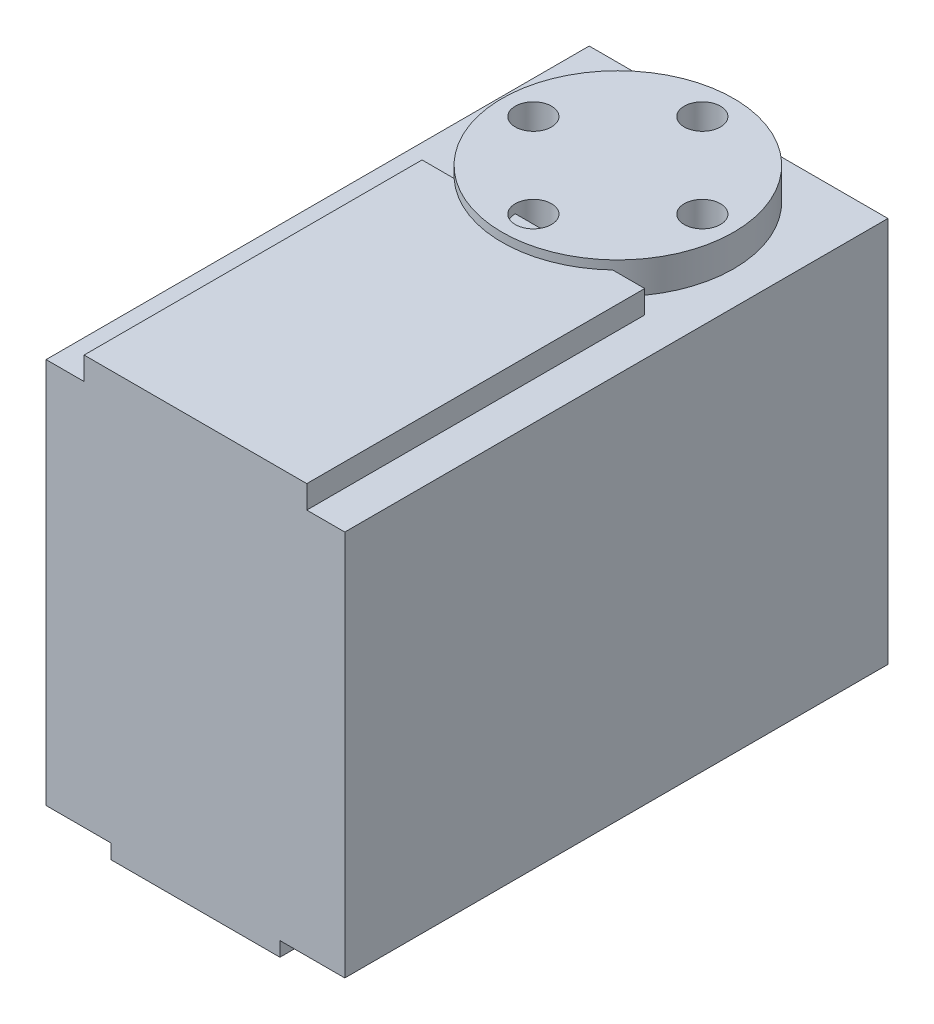
ISO-10303-21;
HEADER;
FILE_DESCRIPTION(('STEP AP214'),'2;1');
FILE_NAME('part.step','',(''),(''),'','','');
FILE_SCHEMA(('AUTOMOTIVE_DESIGN { 1 0 10303 214 1 1 1 1 }'));
ENDSEC;
DATA;
#1=APPLICATION_CONTEXT('core data for automotive mechanical design processes');
#2=APPLICATION_PROTOCOL_DEFINITION('international standard','automotive_design',2000,#1);
#3=PRODUCT_CONTEXT('',#1,'mechanical');
#4=PRODUCT('Part','Part','',(#3));
#5=PRODUCT_RELATED_PRODUCT_CATEGORY('part','',(#4));
#6=PRODUCT_DEFINITION_FORMATION('','',#4);
#7=PRODUCT_DEFINITION_CONTEXT('part definition',#1,'design');
#8=PRODUCT_DEFINITION('design','',#6,#7);
#9=PRODUCT_DEFINITION_SHAPE('','',#8);
#10=(LENGTH_UNIT() NAMED_UNIT(*) SI_UNIT(.MILLI.,.METRE.));
#11=(NAMED_UNIT(*) PLANE_ANGLE_UNIT() SI_UNIT($,.RADIAN.));
#12=(NAMED_UNIT(*) SI_UNIT($,.STERADIAN.) SOLID_ANGLE_UNIT());
#13=UNCERTAINTY_MEASURE_WITH_UNIT(LENGTH_MEASURE(1.E-05),#10,'distance_accuracy_value','');
#14=(GEOMETRIC_REPRESENTATION_CONTEXT(3) GLOBAL_UNCERTAINTY_ASSIGNED_CONTEXT((#13)) GLOBAL_UNIT_ASSIGNED_CONTEXT((#10,
#11,#12)) REPRESENTATION_CONTEXT('',''));
#15=CARTESIAN_POINT('',(0.,0.,0.));
#16=DIRECTION('',(0.,0.,1.));
#17=DIRECTION('',(1.,0.,0.));
#18=AXIS2_PLACEMENT_3D('',#15,#16,#17);
#19=CARTESIAN_POINT('',(0.,0.,17.));
#20=DIRECTION('',(0.,0.,-1.));
#21=DIRECTION('',(-1.,0.,0.));
#22=AXIS2_PLACEMENT_3D('',#19,#20,#21);
#23=PLANE('',#22);
#24=DIRECTION('',(1.,0.,0.));
#25=VECTOR('',#24,1.);
#26=CARTESIAN_POINT('',(8.85449101796407,9.75673652694611,17.));
#27=LINE('',#26,#25);
#28=CARTESIAN_POINT('',(6.1991181002268,9.75673652694611,17.));
#29=VERTEX_POINT('',#28);
#30=CARTESIAN_POINT('',(8.85449101796407,9.75673652694611,17.));
#31=VERTEX_POINT('',#30);
#32=EDGE_CURVE('E213',#29,#31,#27,.T.);
#33=ORIENTED_EDGE('',*,*,#32,.F.);
#34=DIRECTION('',(0.,-1.,0.));
#35=VECTOR('',#34,1.);
#36=CARTESIAN_POINT('',(6.1991181002268,12.3817365269461,17.));
#37=LINE('',#36,#35);
#38=CARTESIAN_POINT('',(6.1991181002268,11.6567365269461,17.));
#39=VERTEX_POINT('',#38);
#40=EDGE_CURVE('E282',#29,#39,#37,.F.);
#41=ORIENTED_EDGE('',*,*,#40,.T.);
#42=DIRECTION('',(-1.,0.,0.));
#43=VECTOR('',#42,1.);
#44=CARTESIAN_POINT('',(-9.59550898203593,11.6567365269461,17.));
#45=LINE('',#44,#43);
#46=CARTESIAN_POINT('',(8.85449101796407,11.6567365269461,17.));
#47=VERTEX_POINT('',#46);
#48=EDGE_CURVE('E217',#47,#39,#45,.T.);
#49=ORIENTED_EDGE('',*,*,#48,.F.);
#50=DIRECTION('',(0.,1.,0.));
#51=VECTOR('',#50,1.);
#52=CARTESIAN_POINT('',(8.85449101796407,11.6567365269461,17.));
#53=LINE('',#52,#51);
#54=EDGE_CURVE('E211',#31,#47,#53,.T.);
#55=ORIENTED_EDGE('',*,*,#54,.F.);
#56=EDGE_LOOP('',(#33,#41,#49,#55));
#57=FACE_BOUND('',#56,.T.);
#58=ADVANCED_FACE('F38',(#57),#23,.T.);
#59=CARTESIAN_POINT('',(-6.94013606429866,11.6567365269461,17.));
#60=VERTEX_POINT('',#59);
#61=CARTESIAN_POINT('',(-9.59550898203593,11.6567365269461,17.));
#62=VERTEX_POINT('',#61);
#63=EDGE_CURVE('E216',#60,#62,#45,.T.);
#64=ORIENTED_EDGE('',*,*,#63,.F.);
#65=DIRECTION('',(0.,-1.,0.));
#66=VECTOR('',#65,1.);
#67=CARTESIAN_POINT('',(-6.94013606429866,12.3817365269461,17.));
#68=LINE('',#67,#66);
#69=CARTESIAN_POINT('',(-6.94013606429866,9.75673652694611,17.));
#70=VERTEX_POINT('',#69);
#71=EDGE_CURVE('E343',#60,#70,#68,.T.);
#72=ORIENTED_EDGE('',*,*,#71,.T.);
#73=CARTESIAN_POINT('',(-9.59550898203593,9.75673652694611,17.));
#74=VERTEX_POINT('',#73);
#75=EDGE_CURVE('E208',#74,#70,#27,.T.);
#76=ORIENTED_EDGE('',*,*,#75,.F.);
#77=DIRECTION('',(0.,-1.,0.));
#78=VECTOR('',#77,1.);
#79=CARTESIAN_POINT('',(-9.59550898203593,9.75673652694611,17.));
#80=LINE('',#79,#78);
#81=EDGE_CURVE('E220',#62,#74,#80,.T.);
#82=ORIENTED_EDGE('',*,*,#81,.F.);
#83=EDGE_LOOP('',(#64,#72,#76,#82));
#84=FACE_BOUND('',#83,.T.);
#85=ADVANCED_FACE('F395',(#84),#23,.T.);
#86=CARTESIAN_POINT('',(0.,0.,17.));
#87=DIRECTION('',(0.,0.,1.));
#88=DIRECTION('',(1.,0.,0.));
#89=AXIS2_PLACEMENT_3D('',#86,#87,#88);
#90=PLANE('',#89);
#91=DIRECTION('',(0.,-1.,0.));
#92=VECTOR('',#91,1.);
#93=CARTESIAN_POINT('',(-6.94013606429866,12.3817365269461,17.));
#94=LINE('',#93,#92);
#95=CARTESIAN_POINT('',(-6.94013606429866,-23.4432634730539,17.));
#96=VERTEX_POINT('',#95);
#97=CARTESIAN_POINT('',(-6.94013606429866,-22.2432634730539,17.));
#98=VERTEX_POINT('',#97);
#99=EDGE_CURVE('E11',#96,#98,#94,.F.);
#100=ORIENTED_EDGE('',*,*,#99,.F.);
#101=DIRECTION('',(1.,0.,0.));
#102=VECTOR('',#101,1.);
#103=CARTESIAN_POINT('',(-7.37050898203592,-23.4432634730539,17.));
#104=LINE('',#103,#102);
#105=CARTESIAN_POINT('',(-7.37050898203592,-23.4432634730539,17.));
#106=VERTEX_POINT('',#105);
#107=EDGE_CURVE('E316',#106,#96,#104,.T.);
#108=ORIENTED_EDGE('',*,*,#107,.F.);
#109=DIRECTION('',(0.,-1.,0.));
#110=VECTOR('',#109,1.);
#111=CARTESIAN_POINT('',(-7.37050898203593,-22.2432634730539,17.));
#112=LINE('',#111,#110);
#113=CARTESIAN_POINT('',(-7.37050898203593,-22.2432634730539,17.));
#114=VERTEX_POINT('',#113);
#115=EDGE_CURVE('E201',#114,#106,#112,.T.);
#116=ORIENTED_EDGE('',*,*,#115,.F.);
#117=DIRECTION('',(-1.,0.,0.));
#118=VECTOR('',#117,1.);
#119=CARTESIAN_POINT('',(6.62949101796407,-22.2432634730539,17.));
#120=LINE('',#119,#118);
#121=EDGE_CURVE('E197',#98,#114,#120,.T.);
#122=ORIENTED_EDGE('',*,*,#121,.F.);
#123=EDGE_LOOP('',(#100,#108,#116,#122));
#124=FACE_BOUND('',#123,.T.);
#125=ADVANCED_FACE('F448',(#124),#90,.F.);
#126=DIRECTION('',(0.,-1.,0.));
#127=VECTOR('',#126,1.);
#128=CARTESIAN_POINT('',(6.1991181002268,12.3817365269461,17.));
#129=LINE('',#128,#127);
#130=CARTESIAN_POINT('',(6.1991181002268,-22.2432634730539,17.));
#131=VERTEX_POINT('',#130);
#132=CARTESIAN_POINT('',(6.1991181002268,-23.4432634730539,17.));
#133=VERTEX_POINT('',#132);
#134=EDGE_CURVE('E47',#131,#133,#129,.T.);
#135=ORIENTED_EDGE('',*,*,#134,.F.);
#136=CARTESIAN_POINT('',(6.62949101796407,-22.2432634730539,17.));
#137=VERTEX_POINT('',#136);
#138=EDGE_CURVE('E196',#137,#131,#120,.T.);
#139=ORIENTED_EDGE('',*,*,#138,.F.);
#140=DIRECTION('',(0.,1.,0.));
#141=VECTOR('',#140,1.);
#142=CARTESIAN_POINT('',(6.62949101796407,-23.4432634730539,17.));
#143=LINE('',#142,#141);
#144=CARTESIAN_POINT('',(6.62949101796407,-23.4432634730539,17.));
#145=VERTEX_POINT('',#144);
#146=EDGE_CURVE('E200',#145,#137,#143,.T.);
#147=ORIENTED_EDGE('',*,*,#146,.F.);
#148=EDGE_CURVE('E303',#133,#145,#104,.T.);
#149=ORIENTED_EDGE('',*,*,#148,.F.);
#150=EDGE_LOOP('',(#135,#139,#147,#149));
#151=FACE_BOUND('',#150,.T.);
#152=ADVANCED_FACE('F334',(#151),#90,.F.);
#153=CARTESIAN_POINT('',(-12.7455089820359,-22.2432634730539,45.));
#154=DIRECTION('',(0.,1.,0.));
#155=DIRECTION('',(0.,0.,1.));
#156=AXIS2_PLACEMENT_3D('',#153,#154,#155);
#157=PLANE('',#156);
#158=CARTESIAN_POINT('',(-0.37050898203593,-22.2432634730539,10.));
#159=DIRECTION('',(0.,1.,0.));
#160=DIRECTION('',(0.,0.,1.));
#161=AXIS2_PLACEMENT_3D('',#158,#159,#160);
#162=CIRCLE('',#161,9.6);
#163=EDGE_CURVE('E338',#98,#131,#162,.F.);
#164=ORIENTED_EDGE('',*,*,#163,.F.);
#165=ORIENTED_EDGE('',*,*,#121,.T.);
#166=DIRECTION('',(0.,0.,1.));
#167=VECTOR('',#166,1.);
#168=CARTESIAN_POINT('',(-7.37050898203593,-22.2432634730539,17.));
#169=LINE('',#168,#167);
#170=CARTESIAN_POINT('',(-7.37050898203593,-22.2432634730539,45.));
#171=VERTEX_POINT('',#170);
#172=EDGE_CURVE('E304',#114,#171,#169,.T.);
#173=ORIENTED_EDGE('',*,*,#172,.T.);
#174=DIRECTION('',(1.,0.,0.));
#175=VECTOR('',#174,1.);
#176=CARTESIAN_POINT('',(-12.7455089820359,-22.2432634730539,45.));
#177=LINE('',#176,#175);
#178=CARTESIAN_POINT('',(-12.7455089820359,-22.2432634730539,45.));
#179=VERTEX_POINT('',#178);
#180=EDGE_CURVE('E249',#179,#171,#177,.T.);
#181=ORIENTED_EDGE('',*,*,#180,.F.);
#182=DIRECTION('',(0.,0.,-1.));
#183=VECTOR('',#182,1.);
#184=CARTESIAN_POINT('',(-12.7455089820359,-22.2432634730539,45.));
#185=LINE('',#184,#183);
#186=CARTESIAN_POINT('',(-12.7455089820359,-22.2432634730539,0.));
#187=VERTEX_POINT('',#186);
#188=EDGE_CURVE('E188',#179,#187,#185,.T.);
#189=ORIENTED_EDGE('',*,*,#188,.T.);
#190=DIRECTION('',(1.,0.,0.));
#191=VECTOR('',#190,1.);
#192=CARTESIAN_POINT('',(-12.7455089820359,-22.2432634730539,0.));
#193=LINE('',#192,#191);
#194=CARTESIAN_POINT('',(12.0044910179641,-22.2432634730539,0.));
#195=VERTEX_POINT('',#194);
#196=EDGE_CURVE('E261',#187,#195,#193,.T.);
#197=ORIENTED_EDGE('',*,*,#196,.T.);
#198=DIRECTION('',(0.,0.,-1.));
#199=VECTOR('',#198,1.);
#200=CARTESIAN_POINT('',(12.0044910179641,-22.2432634730539,45.));
#201=LINE('',#200,#199);
#202=CARTESIAN_POINT('',(12.0044910179641,-22.2432634730539,45.));
#203=VERTEX_POINT('',#202);
#204=EDGE_CURVE('E271',#203,#195,#201,.T.);
#205=ORIENTED_EDGE('',*,*,#204,.F.);
#206=CARTESIAN_POINT('',(6.62949101796407,-22.2432634730539,45.));
#207=VERTEX_POINT('',#206);
#208=EDGE_CURVE('E247',#207,#203,#177,.T.);
#209=ORIENTED_EDGE('',*,*,#208,.F.);
#210=DIRECTION('',(0.,0.,1.));
#211=VECTOR('',#210,1.);
#212=CARTESIAN_POINT('',(6.62949101796407,-22.2432634730539,17.));
#213=LINE('',#212,#211);
#214=EDGE_CURVE('E301',#137,#207,#213,.T.);
#215=ORIENTED_EDGE('',*,*,#214,.F.);
#216=ORIENTED_EDGE('',*,*,#138,.T.);
#217=EDGE_LOOP('',(#164,#165,#173,#181,#189,#197,#205,#209,#215,#216));
#218=FACE_BOUND('',#217,.T.);
#219=ADVANCED_FACE('F337',(#218),#157,.F.);
#220=CARTESIAN_POINT('',(-12.7455089820359,9.75673652694611,45.));
#221=DIRECTION('',(0.,-1.,0.));
#222=DIRECTION('',(0.,0.,-1.));
#223=AXIS2_PLACEMENT_3D('',#220,#221,#222);
#224=PLANE('',#223);
#225=CARTESIAN_POINT('',(-0.37050898203593,9.75673652694611,10.));
#226=DIRECTION('',(0.,-1.,0.));
#227=DIRECTION('',(0.,0.,-1.));
#228=AXIS2_PLACEMENT_3D('',#225,#226,#227);
#229=CIRCLE('',#228,9.6);
#230=EDGE_CURVE('E353',#29,#70,#229,.F.);
#231=ORIENTED_EDGE('',*,*,#230,.F.);
#232=ORIENTED_EDGE('',*,*,#32,.T.);
#233=DIRECTION('',(0.,0.,1.));
#234=VECTOR('',#233,1.);
#235=CARTESIAN_POINT('',(8.85449101796407,9.75673652694611,17.));
#236=LINE('',#235,#234);
#237=CARTESIAN_POINT('',(8.85449101796407,9.75673652694611,45.));
#238=VERTEX_POINT('',#237);
#239=EDGE_CURVE('E224',#31,#238,#236,.T.);
#240=ORIENTED_EDGE('',*,*,#239,.T.);
#241=DIRECTION('',(-1.,0.,0.));
#242=VECTOR('',#241,1.);
#243=CARTESIAN_POINT('',(-12.7455089820359,9.75673652694611,45.));
#244=LINE('',#243,#242);
#245=CARTESIAN_POINT('',(12.0044910179641,9.75673652694611,45.));
#246=VERTEX_POINT('',#245);
#247=EDGE_CURVE('E255',#246,#238,#244,.T.);
#248=ORIENTED_EDGE('',*,*,#247,.F.);
#249=DIRECTION('',(0.,0.,-1.));
#250=VECTOR('',#249,1.);
#251=CARTESIAN_POINT('',(12.0044910179641,9.75673652694611,45.));
#252=LINE('',#251,#250);
#253=CARTESIAN_POINT('',(12.0044910179641,9.75673652694611,0.));
#254=VERTEX_POINT('',#253);
#255=EDGE_CURVE('E268',#246,#254,#252,.T.);
#256=ORIENTED_EDGE('',*,*,#255,.T.);
#257=DIRECTION('',(-1.,0.,0.));
#258=VECTOR('',#257,1.);
#259=CARTESIAN_POINT('',(-12.7455089820359,9.75673652694611,0.));
#260=LINE('',#259,#258);
#261=CARTESIAN_POINT('',(-12.7455089820359,9.75673652694611,0.));
#262=VERTEX_POINT('',#261);
#263=EDGE_CURVE('E248',#254,#262,#260,.T.);
#264=ORIENTED_EDGE('',*,*,#263,.T.);
#265=DIRECTION('',(0.,0.,-1.));
#266=VECTOR('',#265,1.);
#267=CARTESIAN_POINT('',(-12.7455089820359,9.75673652694611,45.));
#268=LINE('',#267,#266);
#269=CARTESIAN_POINT('',(-12.7455089820359,9.75673652694611,45.));
#270=VERTEX_POINT('',#269);
#271=EDGE_CURVE('E258',#270,#262,#268,.T.);
#272=ORIENTED_EDGE('',*,*,#271,.F.);
#273=CARTESIAN_POINT('',(-9.59550898203593,9.75673652694611,45.));
#274=VERTEX_POINT('',#273);
#275=EDGE_CURVE('E254',#274,#270,#244,.T.);
#276=ORIENTED_EDGE('',*,*,#275,.F.);
#277=DIRECTION('',(0.,0.,1.));
#278=VECTOR('',#277,1.);
#279=CARTESIAN_POINT('',(-9.59550898203593,9.75673652694611,17.));
#280=LINE('',#279,#278);
#281=EDGE_CURVE('E235',#74,#274,#280,.T.);
#282=ORIENTED_EDGE('',*,*,#281,.F.);
#283=ORIENTED_EDGE('',*,*,#75,.T.);
#284=EDGE_LOOP('',(#231,#232,#240,#248,#256,#264,#272,#276,#282,#283));
#285=FACE_BOUND('',#284,.T.);
#286=ADVANCED_FACE('F370',(#285),#224,.F.);
#287=CARTESIAN_POINT('',(-12.7455089820359,9.75673652694611,45.));
#288=DIRECTION('',(1.,0.,0.));
#289=DIRECTION('',(0.,1.,0.));
#290=AXIS2_PLACEMENT_3D('',#287,#288,#289);
#291=PLANE('',#290);
#292=DIRECTION('',(0.,-1.,0.));
#293=VECTOR('',#292,1.);
#294=CARTESIAN_POINT('',(-12.7455089820359,9.75673652694611,0.));
#295=LINE('',#294,#293);
#296=EDGE_CURVE('E237',#262,#187,#295,.T.);
#297=ORIENTED_EDGE('',*,*,#296,.T.);
#298=ORIENTED_EDGE('',*,*,#188,.F.);
#299=DIRECTION('',(0.,-1.,0.));
#300=VECTOR('',#299,1.);
#301=CARTESIAN_POINT('',(-12.7455089820359,9.75673652694611,45.));
#302=LINE('',#301,#300);
#303=EDGE_CURVE('E244',#270,#179,#302,.T.);
#304=ORIENTED_EDGE('',*,*,#303,.F.);
#305=ORIENTED_EDGE('',*,*,#271,.T.);
#306=EDGE_LOOP('',(#297,#298,#304,#305));
#307=FACE_BOUND('',#306,.T.);
#308=ADVANCED_FACE('F40',(#307),#291,.F.);
#309=CARTESIAN_POINT('',(12.0044910179641,9.75673652694611,45.));
#310=DIRECTION('',(-1.,0.,0.));
#311=DIRECTION('',(0.,-1.,0.));
#312=AXIS2_PLACEMENT_3D('',#309,#310,#311);
#313=PLANE('',#312);
#314=DIRECTION('',(0.,1.,0.));
#315=VECTOR('',#314,1.);
#316=CARTESIAN_POINT('',(12.0044910179641,9.75673652694611,0.));
#317=LINE('',#316,#315);
#318=EDGE_CURVE('E263',#195,#254,#317,.T.);
#319=ORIENTED_EDGE('',*,*,#318,.T.);
#320=ORIENTED_EDGE('',*,*,#255,.F.);
#321=DIRECTION('',(0.,1.,0.));
#322=VECTOR('',#321,1.);
#323=CARTESIAN_POINT('',(12.0044910179641,9.75673652694611,45.));
#324=LINE('',#323,#322);
#325=EDGE_CURVE('E252',#203,#246,#324,.T.);
#326=ORIENTED_EDGE('',*,*,#325,.F.);
#327=ORIENTED_EDGE('',*,*,#204,.T.);
#328=EDGE_LOOP('',(#319,#320,#326,#327));
#329=FACE_BOUND('',#328,.T.);
#330=ADVANCED_FACE('F377',(#329),#313,.F.);
#331=CARTESIAN_POINT('',(0.,0.,45.));
#332=DIRECTION('',(0.,0.,1.));
#333=DIRECTION('',(1.,0.,0.));
#334=AXIS2_PLACEMENT_3D('',#331,#332,#333);
#335=PLANE('',#334);
#336=ORIENTED_EDGE('',*,*,#303,.T.);
#337=ORIENTED_EDGE('',*,*,#180,.T.);
#338=DIRECTION('',(0.,-1.,0.));
#339=VECTOR('',#338,1.);
#340=CARTESIAN_POINT('',(-7.37050898203593,-22.2432634730539,45.));
#341=LINE('',#340,#339);
#342=CARTESIAN_POINT('',(-7.37050898203592,-23.4432634730539,45.));
#343=VERTEX_POINT('',#342);
#344=EDGE_CURVE('E312',#171,#343,#341,.T.);
#345=ORIENTED_EDGE('',*,*,#344,.T.);
#346=DIRECTION('',(1.,0.,0.));
#347=VECTOR('',#346,1.);
#348=CARTESIAN_POINT('',(-7.37050898203592,-23.4432634730539,45.));
#349=LINE('',#348,#347);
#350=CARTESIAN_POINT('',(6.62949101796407,-23.4432634730539,45.));
#351=VERTEX_POINT('',#350);
#352=EDGE_CURVE('E207',#343,#351,#349,.T.);
#353=ORIENTED_EDGE('',*,*,#352,.T.);
#354=DIRECTION('',(0.,1.,0.));
#355=VECTOR('',#354,1.);
#356=CARTESIAN_POINT('',(6.62949101796407,-23.4432634730539,45.));
#357=LINE('',#356,#355);
#358=EDGE_CURVE('E229',#351,#207,#357,.T.);
#359=ORIENTED_EDGE('',*,*,#358,.T.);
#360=ORIENTED_EDGE('',*,*,#208,.T.);
#361=ORIENTED_EDGE('',*,*,#325,.T.);
#362=ORIENTED_EDGE('',*,*,#247,.T.);
#363=DIRECTION('',(0.,1.,0.));
#364=VECTOR('',#363,1.);
#365=CARTESIAN_POINT('',(8.85449101796407,11.6567365269461,45.));
#366=LINE('',#365,#364);
#367=CARTESIAN_POINT('',(8.85449101796407,11.6567365269461,45.));
#368=VERTEX_POINT('',#367);
#369=EDGE_CURVE('E225',#238,#368,#366,.T.);
#370=ORIENTED_EDGE('',*,*,#369,.T.);
#371=DIRECTION('',(-1.,0.,0.));
#372=VECTOR('',#371,1.);
#373=CARTESIAN_POINT('',(-9.59550898203593,11.6567365269461,45.));
#374=LINE('',#373,#372);
#375=CARTESIAN_POINT('',(-9.59550898203593,11.6567365269461,45.));
#376=VERTEX_POINT('',#375);
#377=EDGE_CURVE('E228',#368,#376,#374,.T.);
#378=ORIENTED_EDGE('',*,*,#377,.T.);
#379=DIRECTION('',(0.,-1.,0.));
#380=VECTOR('',#379,1.);
#381=CARTESIAN_POINT('',(-9.59550898203593,9.75673652694611,45.));
#382=LINE('',#381,#380);
#383=EDGE_CURVE('E232',#376,#274,#382,.T.);
#384=ORIENTED_EDGE('',*,*,#383,.T.);
#385=ORIENTED_EDGE('',*,*,#275,.T.);
#386=EDGE_LOOP('',(#336,#337,#345,#353,#359,#360,#361,#362,#370,#378,#384,#385));
#387=FACE_BOUND('',#386,.T.);
#388=ADVANCED_FACE('F372',(#387),#335,.T.);
#389=CARTESIAN_POINT('',(0.,0.,0.));
#390=DIRECTION('',(0.,0.,1.));
#391=DIRECTION('',(1.,0.,0.));
#392=AXIS2_PLACEMENT_3D('',#389,#390,#391);
#393=PLANE('',#392);
#394=ORIENTED_EDGE('',*,*,#296,.F.);
#395=ORIENTED_EDGE('',*,*,#263,.F.);
#396=ORIENTED_EDGE('',*,*,#318,.F.);
#397=ORIENTED_EDGE('',*,*,#196,.F.);
#398=EDGE_LOOP('',(#394,#395,#396,#397));
#399=FACE_BOUND('',#398,.T.);
#400=ADVANCED_FACE('F383',(#399),#393,.F.);
#401=CARTESIAN_POINT('',(-9.59550898203593,9.75673652694611,17.));
#402=DIRECTION('',(-1.,0.,0.));
#403=DIRECTION('',(0.,0.,1.));
#404=AXIS2_PLACEMENT_3D('',#401,#402,#403);
#405=PLANE('',#404);
#406=ORIENTED_EDGE('',*,*,#383,.F.);
#407=DIRECTION('',(0.,0.,1.));
#408=VECTOR('',#407,1.);
#409=CARTESIAN_POINT('',(-9.59550898203593,11.6567365269461,17.));
#410=LINE('',#409,#408);
#411=EDGE_CURVE('E238',#62,#376,#410,.T.);
#412=ORIENTED_EDGE('',*,*,#411,.F.);
#413=ORIENTED_EDGE('',*,*,#81,.T.);
#414=ORIENTED_EDGE('',*,*,#281,.T.);
#415=EDGE_LOOP('',(#406,#412,#413,#414));
#416=FACE_BOUND('',#415,.T.);
#417=ADVANCED_FACE('F392',(#416),#405,.T.);
#418=CARTESIAN_POINT('',(-9.59550898203593,11.6567365269461,17.));
#419=DIRECTION('',(0.,1.,0.));
#420=DIRECTION('',(0.,0.,1.));
#421=AXIS2_PLACEMENT_3D('',#418,#419,#420);
#422=PLANE('',#421);
#423=ORIENTED_EDGE('',*,*,#48,.T.);
#424=CARTESIAN_POINT('',(-0.37050898203593,11.6567365269461,10.));
#425=DIRECTION('',(0.,1.,0.));
#426=DIRECTION('',(0.,0.,1.));
#427=AXIS2_PLACEMENT_3D('',#424,#425,#426);
#428=CIRCLE('',#427,9.6);
#429=EDGE_CURVE('E346',#39,#60,#428,.F.);
#430=ORIENTED_EDGE('',*,*,#429,.T.);
#431=ORIENTED_EDGE('',*,*,#63,.T.);
#432=ORIENTED_EDGE('',*,*,#411,.T.);
#433=ORIENTED_EDGE('',*,*,#377,.F.);
#434=DIRECTION('',(0.,0.,1.));
#435=VECTOR('',#434,1.);
#436=CARTESIAN_POINT('',(8.85449101796407,11.6567365269461,17.));
#437=LINE('',#436,#435);
#438=EDGE_CURVE('E240',#47,#368,#437,.T.);
#439=ORIENTED_EDGE('',*,*,#438,.F.);
#440=EDGE_LOOP('',(#423,#430,#431,#432,#433,#439));
#441=FACE_BOUND('',#440,.T.);
#442=ADVANCED_FACE('F362',(#441),#422,.T.);
#443=CARTESIAN_POINT('',(8.85449101796407,11.6567365269461,17.));
#444=DIRECTION('',(1.,0.,0.));
#445=DIRECTION('',(0.,0.,-1.));
#446=AXIS2_PLACEMENT_3D('',#443,#444,#445);
#447=PLANE('',#446);
#448=ORIENTED_EDGE('',*,*,#369,.F.);
#449=ORIENTED_EDGE('',*,*,#239,.F.);
#450=ORIENTED_EDGE('',*,*,#54,.T.);
#451=ORIENTED_EDGE('',*,*,#438,.T.);
#452=EDGE_LOOP('',(#448,#449,#450,#451));
#453=FACE_BOUND('',#452,.T.);
#454=ADVANCED_FACE('F366',(#453),#447,.T.);
#455=CARTESIAN_POINT('',(6.62949101796407,-23.4432634730539,17.));
#456=DIRECTION('',(1.,0.,0.));
#457=DIRECTION('',(0.,0.,-1.));
#458=AXIS2_PLACEMENT_3D('',#455,#456,#457);
#459=PLANE('',#458);
#460=ORIENTED_EDGE('',*,*,#358,.F.);
#461=DIRECTION('',(0.,0.,1.));
#462=VECTOR('',#461,1.);
#463=CARTESIAN_POINT('',(6.62949101796407,-23.4432634730539,17.));
#464=LINE('',#463,#462);
#465=EDGE_CURVE('E300',#145,#351,#464,.T.);
#466=ORIENTED_EDGE('',*,*,#465,.F.);
#467=ORIENTED_EDGE('',*,*,#146,.T.);
#468=ORIENTED_EDGE('',*,*,#214,.T.);
#469=EDGE_LOOP('',(#460,#466,#467,#468));
#470=FACE_BOUND('',#469,.T.);
#471=ADVANCED_FACE('F332',(#470),#459,.T.);
#472=CARTESIAN_POINT('',(-7.37050898203592,-23.4432634730539,17.));
#473=DIRECTION('',(0.,-1.,0.));
#474=DIRECTION('',(1.,0.,0.));
#475=AXIS2_PLACEMENT_3D('',#472,#473,#474);
#476=PLANE('',#475);
#477=ORIENTED_EDGE('',*,*,#107,.T.);
#478=CARTESIAN_POINT('',(-0.37050898203593,-23.4432634730539,10.));
#479=DIRECTION('',(0.,-1.,0.));
#480=DIRECTION('',(1.,0.,0.));
#481=AXIS2_PLACEMENT_3D('',#478,#479,#480);
#482=CIRCLE('',#481,9.6);
#483=EDGE_CURVE('E328',#96,#133,#482,.F.);
#484=ORIENTED_EDGE('',*,*,#483,.T.);
#485=ORIENTED_EDGE('',*,*,#148,.T.);
#486=ORIENTED_EDGE('',*,*,#465,.T.);
#487=ORIENTED_EDGE('',*,*,#352,.F.);
#488=DIRECTION('',(0.,0.,1.));
#489=VECTOR('',#488,1.);
#490=CARTESIAN_POINT('',(-7.37050898203592,-23.4432634730539,17.));
#491=LINE('',#490,#489);
#492=EDGE_CURVE('E307',#106,#343,#491,.T.);
#493=ORIENTED_EDGE('',*,*,#492,.F.);
#494=EDGE_LOOP('',(#477,#484,#485,#486,#487,#493));
#495=FACE_BOUND('',#494,.T.);
#496=ADVANCED_FACE('F325',(#495),#476,.T.);
#497=CARTESIAN_POINT('',(-7.37050898203593,-22.2432634730539,17.));
#498=DIRECTION('',(-1.,0.,0.));
#499=DIRECTION('',(0.,-1.,0.));
#500=AXIS2_PLACEMENT_3D('',#497,#498,#499);
#501=PLANE('',#500);
#502=ORIENTED_EDGE('',*,*,#344,.F.);
#503=ORIENTED_EDGE('',*,*,#172,.F.);
#504=ORIENTED_EDGE('',*,*,#115,.T.);
#505=ORIENTED_EDGE('',*,*,#492,.T.);
#506=EDGE_LOOP('',(#502,#503,#504,#505));
#507=FACE_BOUND('',#506,.T.);
#508=ADVANCED_FACE('F535',(#507),#501,.T.);
#509=CARTESIAN_POINT('',(-7.37050898203584,12.3817365269461,10.));
#510=DIRECTION('',(0.,-1.,0.));
#511=DIRECTION('',(0.,0.,-1.));
#512=AXIS2_PLACEMENT_3D('',#509,#510,#511);
#513=CYLINDRICAL_SURFACE('',#512,1.5);
#514=CARTESIAN_POINT('',(-7.37050898203584,-24.8682634730539,10.));
#515=DIRECTION('',(0.,1.,0.));
#516=DIRECTION('',(0.,0.,1.));
#517=AXIS2_PLACEMENT_3D('',#514,#515,#516);
#518=CIRCLE('',#517,1.5);
#519=CARTESIAN_POINT('',(-7.37050898203584,-24.8682634730539,11.5));
#520=VERTEX_POINT('',#519);
#521=EDGE_CURVE('E485',#520,#520,#518,.T.);
#522=ORIENTED_EDGE('',*,*,#521,.F.);
#523=EDGE_LOOP('',(#522));
#524=FACE_BOUND('',#523,.T.);
#525=CARTESIAN_POINT('',(-7.37050898203584,-22.2432634730539,10.));
#526=DIRECTION('',(0.,1.,0.));
#527=DIRECTION('',(0.,0.,1.));
#528=AXIS2_PLACEMENT_3D('',#525,#526,#527);
#529=CIRCLE('',#528,1.5);
#530=CARTESIAN_POINT('',(-7.37050898203584,-22.2432634730539,11.5));
#531=VERTEX_POINT('',#530);
#532=EDGE_CURVE('E281',#531,#531,#529,.F.);
#533=ORIENTED_EDGE('',*,*,#532,.F.);
#534=EDGE_LOOP('',(#533));
#535=FACE_BOUND('',#534,.T.);
#536=ADVANCED_FACE('F540',(#524,#535),#513,.F.);
#537=CARTESIAN_POINT('',(6.62949101796417,12.3817365269461,9.99999999999992));
#538=DIRECTION('',(0.,-1.,0.));
#539=DIRECTION('',(0.,0.,-1.));
#540=AXIS2_PLACEMENT_3D('',#537,#538,#539);
#541=CYLINDRICAL_SURFACE('',#540,1.5);
#542=CARTESIAN_POINT('',(6.62949101796417,-24.8682634730539,9.99999999999992));
#543=DIRECTION('',(0.,1.,0.));
#544=DIRECTION('',(0.,0.,1.));
#545=AXIS2_PLACEMENT_3D('',#542,#543,#544);
#546=CIRCLE('',#545,1.5);
#547=CARTESIAN_POINT('',(6.62949101796417,-24.8682634730539,11.4999999999999));
#548=VERTEX_POINT('',#547);
#549=EDGE_CURVE('E482',#548,#548,#546,.T.);
#550=ORIENTED_EDGE('',*,*,#549,.F.);
#551=EDGE_LOOP('',(#550));
#552=FACE_BOUND('',#551,.T.);
#553=CARTESIAN_POINT('',(6.62949101796417,-22.2432634730539,9.99999999999992));
#554=DIRECTION('',(0.,1.,0.));
#555=DIRECTION('',(0.,0.,1.));
#556=AXIS2_PLACEMENT_3D('',#553,#554,#555);
#557=CIRCLE('',#556,1.5);
#558=CARTESIAN_POINT('',(6.62949101796417,-22.2432634730539,11.4999999999999));
#559=VERTEX_POINT('',#558);
#560=EDGE_CURVE('E285',#559,#559,#557,.F.);
#561=ORIENTED_EDGE('',*,*,#560,.F.);
#562=EDGE_LOOP('',(#561));
#563=FACE_BOUND('',#562,.T.);
#564=ADVANCED_FACE('F502',(#552,#563),#541,.F.);
#565=CARTESIAN_POINT('',(-0.37050898203593,12.3817365269461,3.));
#566=DIRECTION('',(0.,-1.,0.));
#567=DIRECTION('',(0.,0.,-1.));
#568=AXIS2_PLACEMENT_3D('',#565,#566,#567);
#569=CYLINDRICAL_SURFACE('',#568,1.5);
#570=CARTESIAN_POINT('',(-0.37050898203593,-24.8682634730539,3.));
#571=DIRECTION('',(0.,1.,0.));
#572=DIRECTION('',(0.,0.,1.));
#573=AXIS2_PLACEMENT_3D('',#570,#571,#572);
#574=CIRCLE('',#573,1.5);
#575=CARTESIAN_POINT('',(-0.37050898203593,-24.8682634730539,4.5));
#576=VERTEX_POINT('',#575);
#577=EDGE_CURVE('E413',#576,#576,#574,.T.);
#578=ORIENTED_EDGE('',*,*,#577,.F.);
#579=EDGE_LOOP('',(#578));
#580=FACE_BOUND('',#579,.T.);
#581=CARTESIAN_POINT('',(-0.37050898203593,-22.2432634730539,3.));
#582=DIRECTION('',(0.,1.,0.));
#583=DIRECTION('',(0.,0.,1.));
#584=AXIS2_PLACEMENT_3D('',#581,#582,#583);
#585=CIRCLE('',#584,1.5);
#586=CARTESIAN_POINT('',(-0.37050898203593,-22.2432634730539,4.5));
#587=VERTEX_POINT('',#586);
#588=EDGE_CURVE('E297',#587,#587,#585,.F.);
#589=ORIENTED_EDGE('',*,*,#588,.F.);
#590=EDGE_LOOP('',(#589));
#591=FACE_BOUND('',#590,.T.);
#592=ADVANCED_FACE('F471',(#580,#591),#569,.F.);
#593=CARTESIAN_POINT('',(-0.37050898203593,12.3817365269461,10.));
#594=DIRECTION('',(0.,-1.,0.));
#595=DIRECTION('',(0.,0.,-1.));
#596=AXIS2_PLACEMENT_3D('',#593,#594,#595);
#597=CYLINDRICAL_SURFACE('',#596,9.6);
#598=CARTESIAN_POINT('',(-0.37050898203593,-24.8682634730539,10.));
#599=DIRECTION('',(0.,1.,0.));
#600=DIRECTION('',(0.,0.,1.));
#601=AXIS2_PLACEMENT_3D('',#598,#599,#600);
#602=CIRCLE('',#601,9.6);
#603=CARTESIAN_POINT('',(-0.37050898203593,-24.8682634730539,19.6));
#604=VERTEX_POINT('',#603);
#605=EDGE_CURVE('E406',#604,#604,#602,.T.);
#606=ORIENTED_EDGE('',*,*,#605,.T.);
#607=EDGE_LOOP('',(#606));
#608=FACE_BOUND('',#607,.T.);
#609=ORIENTED_EDGE('',*,*,#483,.F.);
#610=ORIENTED_EDGE('',*,*,#99,.T.);
#611=ORIENTED_EDGE('',*,*,#163,.T.);
#612=ORIENTED_EDGE('',*,*,#134,.T.);
#613=EDGE_LOOP('',(#609,#610,#611,#612));
#614=FACE_BOUND('',#613,.T.);
#615=ADVANCED_FACE('F342',(#608,#614),#597,.T.);
#616=CARTESIAN_POINT('',(-0.37050898203593,-24.8682634730539,10.));
#617=DIRECTION('',(0.,1.,0.));
#618=DIRECTION('',(0.,0.,1.));
#619=AXIS2_PLACEMENT_3D('',#616,#617,#618);
#620=PLANE('',#619);
#621=ORIENTED_EDGE('',*,*,#605,.F.);
#622=EDGE_LOOP('',(#621));
#623=FACE_BOUND('',#622,.T.);
#624=ORIENTED_EDGE('',*,*,#577,.T.);
#625=EDGE_LOOP('',(#624));
#626=FACE_BOUND('',#625,.T.);
#627=ORIENTED_EDGE('',*,*,#549,.T.);
#628=EDGE_LOOP('',(#627));
#629=FACE_BOUND('',#628,.T.);
#630=CARTESIAN_POINT('',(-0.370508982035784,-24.8682634730539,17.));
#631=DIRECTION('',(0.,1.,0.));
#632=DIRECTION('',(0.,0.,1.));
#633=AXIS2_PLACEMENT_3D('',#630,#631,#632);
#634=CIRCLE('',#633,1.5);
#635=CARTESIAN_POINT('',(-0.370508982035784,-24.8682634730539,18.5));
#636=VERTEX_POINT('',#635);
#637=EDGE_CURVE('E476',#636,#636,#634,.T.);
#638=ORIENTED_EDGE('',*,*,#637,.T.);
#639=EDGE_LOOP('',(#638));
#640=FACE_BOUND('',#639,.T.);
#641=ORIENTED_EDGE('',*,*,#521,.T.);
#642=EDGE_LOOP('',(#641));
#643=FACE_BOUND('',#642,.T.);
#644=ADVANCED_FACE('F462',(#623,#626,#629,#640,#643),#620,.F.);
#645=CARTESIAN_POINT('',(-0.370508982035784,12.3817365269461,17.));
#646=DIRECTION('',(0.,-1.,0.));
#647=DIRECTION('',(0.,0.,-1.));
#648=AXIS2_PLACEMENT_3D('',#645,#646,#647);
#649=CYLINDRICAL_SURFACE('',#648,1.5);
#650=ORIENTED_EDGE('',*,*,#637,.F.);
#651=EDGE_LOOP('',(#650));
#652=FACE_BOUND('',#651,.T.);
#653=DIRECTION('',(0.,-1.,0.));
#654=VECTOR('',#653,1.);
#655=CARTESIAN_POINT('',(-1.87050898203578,12.3817365269461,17.));
#656=LINE('',#655,#654);
#657=CARTESIAN_POINT('',(-1.87050898203578,-23.4432634730539,17.));
#658=VERTEX_POINT('',#657);
#659=CARTESIAN_POINT('',(-1.87050898203578,-22.2432634730539,17.));
#660=VERTEX_POINT('',#659);
#661=EDGE_CURVE('E187',#658,#660,#656,.F.);
#662=ORIENTED_EDGE('',*,*,#661,.F.);
#663=CARTESIAN_POINT('',(-0.370508982035784,-23.4432634730539,17.));
#664=DIRECTION('',(0.,-1.,0.));
#665=DIRECTION('',(1.,0.,0.));
#666=AXIS2_PLACEMENT_3D('',#663,#664,#665);
#667=CIRCLE('',#666,1.5);
#668=CARTESIAN_POINT('',(1.12949101796421,-23.4432634730539,17.));
#669=VERTEX_POINT('',#668);
#670=EDGE_CURVE('E182',#658,#669,#667,.F.);
#671=ORIENTED_EDGE('',*,*,#670,.T.);
#672=DIRECTION('',(0.,-1.,0.));
#673=VECTOR('',#672,1.);
#674=CARTESIAN_POINT('',(1.12949101796422,12.3817365269461,17.));
#675=LINE('',#674,#673);
#676=CARTESIAN_POINT('',(1.12949101796422,-22.2432634730539,17.));
#677=VERTEX_POINT('',#676);
#678=EDGE_CURVE('E176',#677,#669,#675,.T.);
#679=ORIENTED_EDGE('',*,*,#678,.F.);
#680=CARTESIAN_POINT('',(-0.370508982035784,-22.2432634730539,17.));
#681=DIRECTION('',(0.,1.,0.));
#682=DIRECTION('',(0.,0.,1.));
#683=AXIS2_PLACEMENT_3D('',#680,#681,#682);
#684=CIRCLE('',#683,1.5);
#685=EDGE_CURVE('E179',#660,#677,#684,.F.);
#686=ORIENTED_EDGE('',*,*,#685,.F.);
#687=EDGE_LOOP('',(#662,#671,#679,#686));
#688=FACE_BOUND('',#687,.T.);
#689=ADVANCED_FACE('F178',(#652,#688),#649,.F.);
#690=CARTESIAN_POINT('',(-0.37050898203593,12.3817365269461,3.));
#691=DIRECTION('',(0.,1.,0.));
#692=DIRECTION('',(0.,0.,1.));
#693=AXIS2_PLACEMENT_3D('',#690,#691,#692);
#694=CIRCLE('',#693,1.5);
#695=CARTESIAN_POINT('',(-0.37050898203593,12.3817365269461,4.5));
#696=VERTEX_POINT('',#695);
#697=EDGE_CURVE('E410',#696,#696,#694,.T.);
#698=ORIENTED_EDGE('',*,*,#697,.T.);
#699=EDGE_LOOP('',(#698));
#700=FACE_BOUND('',#699,.T.);
#701=CARTESIAN_POINT('',(-0.37050898203593,9.75673652694611,3.));
#702=DIRECTION('',(0.,-1.,0.));
#703=DIRECTION('',(0.,0.,-1.));
#704=AXIS2_PLACEMENT_3D('',#701,#702,#703);
#705=CIRCLE('',#704,1.5);
#706=CARTESIAN_POINT('',(-0.37050898203593,9.75673652694611,1.5));
#707=VERTEX_POINT('',#706);
#708=EDGE_CURVE('E42',#707,#707,#705,.F.);
#709=ORIENTED_EDGE('',*,*,#708,.F.);
#710=EDGE_LOOP('',(#709));
#711=FACE_BOUND('',#710,.T.);
#712=ADVANCED_FACE('F461',(#700,#711),#569,.F.);
#713=CARTESIAN_POINT('',(6.62949101796417,12.3817365269461,9.99999999999992));
#714=DIRECTION('',(0.,1.,0.));
#715=DIRECTION('',(0.,0.,1.));
#716=AXIS2_PLACEMENT_3D('',#713,#714,#715);
#717=CIRCLE('',#716,1.5);
#718=CARTESIAN_POINT('',(6.62949101796417,12.3817365269461,11.4999999999999));
#719=VERTEX_POINT('',#718);
#720=EDGE_CURVE('E489',#719,#719,#717,.T.);
#721=ORIENTED_EDGE('',*,*,#720,.T.);
#722=EDGE_LOOP('',(#721));
#723=FACE_BOUND('',#722,.T.);
#724=CARTESIAN_POINT('',(6.62949101796417,9.75673652694611,9.99999999999992));
#725=DIRECTION('',(0.,-1.,0.));
#726=DIRECTION('',(0.,0.,-1.));
#727=AXIS2_PLACEMENT_3D('',#724,#725,#726);
#728=CIRCLE('',#727,1.5);
#729=CARTESIAN_POINT('',(6.62949101796417,9.75673652694611,8.49999999999992));
#730=VERTEX_POINT('',#729);
#731=EDGE_CURVE('E283',#730,#730,#728,.F.);
#732=ORIENTED_EDGE('',*,*,#731,.F.);
#733=EDGE_LOOP('',(#732));
#734=FACE_BOUND('',#733,.T.);
#735=ADVANCED_FACE('F468',(#723,#734),#541,.F.);
#736=CARTESIAN_POINT('',(-7.37050898203584,12.3817365269461,10.));
#737=DIRECTION('',(0.,1.,0.));
#738=DIRECTION('',(0.,0.,1.));
#739=AXIS2_PLACEMENT_3D('',#736,#737,#738);
#740=CIRCLE('',#739,1.5);
#741=CARTESIAN_POINT('',(-7.37050898203584,12.3817365269461,11.5));
#742=VERTEX_POINT('',#741);
#743=EDGE_CURVE('E479',#742,#742,#740,.T.);
#744=ORIENTED_EDGE('',*,*,#743,.T.);
#745=EDGE_LOOP('',(#744));
#746=FACE_BOUND('',#745,.T.);
#747=CARTESIAN_POINT('',(-7.37050898203584,9.75673652694611,10.));
#748=DIRECTION('',(0.,-1.,0.));
#749=DIRECTION('',(0.,0.,-1.));
#750=AXIS2_PLACEMENT_3D('',#747,#748,#749);
#751=CIRCLE('',#750,1.5);
#752=CARTESIAN_POINT('',(-7.37050898203584,9.75673652694611,8.50000000000002));
#753=VERTEX_POINT('',#752);
#754=EDGE_CURVE('E279',#753,#753,#751,.F.);
#755=ORIENTED_EDGE('',*,*,#754,.F.);
#756=EDGE_LOOP('',(#755));
#757=FACE_BOUND('',#756,.T.);
#758=ADVANCED_FACE('F549',(#746,#757),#513,.F.);
#759=CARTESIAN_POINT('',(-0.37050898203593,12.3817365269461,10.));
#760=DIRECTION('',(0.,1.,0.));
#761=DIRECTION('',(0.,0.,1.));
#762=AXIS2_PLACEMENT_3D('',#759,#760,#761);
#763=PLANE('',#762);
#764=CARTESIAN_POINT('',(-0.370508982035784,12.3817365269461,17.));
#765=DIRECTION('',(0.,1.,0.));
#766=DIRECTION('',(0.,0.,1.));
#767=AXIS2_PLACEMENT_3D('',#764,#765,#766);
#768=CIRCLE('',#767,1.5);
#769=CARTESIAN_POINT('',(-0.370508982035784,12.3817365269461,18.5));
#770=VERTEX_POINT('',#769);
#771=EDGE_CURVE('E478',#770,#770,#768,.T.);
#772=ORIENTED_EDGE('',*,*,#771,.F.);
#773=EDGE_LOOP('',(#772));
#774=FACE_BOUND('',#773,.T.);
#775=ORIENTED_EDGE('',*,*,#697,.F.);
#776=EDGE_LOOP('',(#775));
#777=FACE_BOUND('',#776,.T.);
#778=CARTESIAN_POINT('',(-0.37050898203593,12.3817365269461,10.));
#779=DIRECTION('',(0.,1.,0.));
#780=DIRECTION('',(0.,0.,1.));
#781=AXIS2_PLACEMENT_3D('',#778,#779,#780);
#782=CIRCLE('',#781,9.6);
#783=CARTESIAN_POINT('',(-0.37050898203593,12.3817365269461,19.6));
#784=VERTEX_POINT('',#783);
#785=EDGE_CURVE('E404',#784,#784,#782,.T.);
#786=ORIENTED_EDGE('',*,*,#785,.T.);
#787=EDGE_LOOP('',(#786));
#788=FACE_BOUND('',#787,.T.);
#789=ORIENTED_EDGE('',*,*,#720,.F.);
#790=EDGE_LOOP('',(#789));
#791=FACE_BOUND('',#790,.T.);
#792=ORIENTED_EDGE('',*,*,#743,.F.);
#793=EDGE_LOOP('',(#792));
#794=FACE_BOUND('',#793,.T.);
#795=ADVANCED_FACE('F400',(#774,#777,#788,#791,#794),#763,.T.);
#796=ORIENTED_EDGE('',*,*,#40,.F.);
#797=ORIENTED_EDGE('',*,*,#230,.T.);
#798=ORIENTED_EDGE('',*,*,#71,.F.);
#799=ORIENTED_EDGE('',*,*,#429,.F.);
#800=EDGE_LOOP('',(#796,#797,#798,#799));
#801=FACE_BOUND('',#800,.T.);
#802=ORIENTED_EDGE('',*,*,#785,.F.);
#803=EDGE_LOOP('',(#802));
#804=FACE_BOUND('',#803,.T.);
#805=ADVANCED_FACE('F396',(#801,#804),#597,.T.);
#806=CARTESIAN_POINT('',(-0.370508982035784,9.75673652694611,17.));
#807=DIRECTION('',(0.,-1.,0.));
#808=DIRECTION('',(0.,0.,-1.));
#809=AXIS2_PLACEMENT_3D('',#806,#807,#808);
#810=CIRCLE('',#809,1.5);
#811=CARTESIAN_POINT('',(1.12949101796422,9.75673652694611,17.));
#812=VERTEX_POINT('',#811);
#813=CARTESIAN_POINT('',(-1.87050898203578,9.75673652694611,17.));
#814=VERTEX_POINT('',#813);
#815=EDGE_CURVE('E418',#812,#814,#810,.F.);
#816=ORIENTED_EDGE('',*,*,#815,.F.);
#817=DIRECTION('',(0.,-1.,0.));
#818=VECTOR('',#817,1.);
#819=CARTESIAN_POINT('',(1.12949101796422,12.3817365269461,17.));
#820=LINE('',#819,#818);
#821=CARTESIAN_POINT('',(1.12949101796422,11.6567365269461,17.));
#822=VERTEX_POINT('',#821);
#823=EDGE_CURVE('E348',#812,#822,#820,.F.);
#824=ORIENTED_EDGE('',*,*,#823,.T.);
#825=CARTESIAN_POINT('',(-0.370508982035784,11.6567365269461,17.));
#826=DIRECTION('',(0.,1.,0.));
#827=DIRECTION('',(0.,0.,1.));
#828=AXIS2_PLACEMENT_3D('',#825,#826,#827);
#829=CIRCLE('',#828,1.5);
#830=CARTESIAN_POINT('',(-1.87050898203578,11.6567365269461,17.));
#831=VERTEX_POINT('',#830);
#832=EDGE_CURVE('E61',#822,#831,#829,.F.);
#833=ORIENTED_EDGE('',*,*,#832,.T.);
#834=DIRECTION('',(0.,-1.,0.));
#835=VECTOR('',#834,1.);
#836=CARTESIAN_POINT('',(-1.87050898203578,12.3817365269461,17.));
#837=LINE('',#836,#835);
#838=EDGE_CURVE('E55',#831,#814,#837,.T.);
#839=ORIENTED_EDGE('',*,*,#838,.T.);
#840=EDGE_LOOP('',(#816,#824,#833,#839));
#841=FACE_BOUND('',#840,.T.);
#842=ORIENTED_EDGE('',*,*,#771,.T.);
#843=EDGE_LOOP('',(#842));
#844=FACE_BOUND('',#843,.T.);
#845=ADVANCED_FACE('F399',(#841,#844),#649,.F.);
#846=ORIENTED_EDGE('',*,*,#823,.F.);
#847=EDGE_CURVE('E212',#814,#812,#27,.T.);
#848=ORIENTED_EDGE('',*,*,#847,.F.);
#849=ORIENTED_EDGE('',*,*,#838,.F.);
#850=EDGE_CURVE('E221',#822,#831,#45,.T.);
#851=ORIENTED_EDGE('',*,*,#850,.F.);
#852=EDGE_LOOP('',(#846,#848,#849,#851));
#853=FACE_BOUND('',#852,.T.);
#854=ADVANCED_FACE('F425',(#853),#23,.T.);
#855=ORIENTED_EDGE('',*,*,#832,.F.);
#856=ORIENTED_EDGE('',*,*,#850,.T.);
#857=EDGE_LOOP('',(#855,#856));
#858=FACE_BOUND('',#857,.T.);
#859=ADVANCED_FACE('F430',(#858),#422,.T.);
#860=ORIENTED_EDGE('',*,*,#847,.T.);
#861=ORIENTED_EDGE('',*,*,#815,.T.);
#862=EDGE_LOOP('',(#860,#861));
#863=FACE_BOUND('',#862,.T.);
#864=ADVANCED_FACE('F427',(#863),#224,.F.);
#865=ORIENTED_EDGE('',*,*,#754,.T.);
#866=EDGE_LOOP('',(#865));
#867=FACE_BOUND('',#866,.T.);
#868=ADVANCED_FACE('F429',(#867),#224,.F.);
#869=ORIENTED_EDGE('',*,*,#731,.T.);
#870=EDGE_LOOP('',(#869));
#871=FACE_BOUND('',#870,.T.);
#872=ADVANCED_FACE('F432',(#871),#224,.F.);
#873=ORIENTED_EDGE('',*,*,#708,.T.);
#874=EDGE_LOOP('',(#873));
#875=FACE_BOUND('',#874,.T.);
#876=ADVANCED_FACE('F442',(#875),#224,.F.);
#877=ORIENTED_EDGE('',*,*,#532,.T.);
#878=EDGE_LOOP('',(#877));
#879=FACE_BOUND('',#878,.T.);
#880=ADVANCED_FACE('F513',(#879),#157,.F.);
#881=ORIENTED_EDGE('',*,*,#560,.T.);
#882=EDGE_LOOP('',(#881));
#883=FACE_BOUND('',#882,.T.);
#884=ADVANCED_FACE('F507',(#883),#157,.F.);
#885=ORIENTED_EDGE('',*,*,#588,.T.);
#886=EDGE_LOOP('',(#885));
#887=FACE_BOUND('',#886,.T.);
#888=ADVANCED_FACE('F505',(#887),#157,.F.);
#889=EDGE_CURVE('E318',#658,#669,#104,.T.);
#890=ORIENTED_EDGE('',*,*,#889,.F.);
#891=ORIENTED_EDGE('',*,*,#661,.T.);
#892=EDGE_CURVE('E193',#677,#660,#120,.T.);
#893=ORIENTED_EDGE('',*,*,#892,.F.);
#894=ORIENTED_EDGE('',*,*,#678,.T.);
#895=EDGE_LOOP('',(#890,#891,#893,#894));
#896=FACE_BOUND('',#895,.T.);
#897=ADVANCED_FACE('F195',(#896),#90,.F.);
#898=ORIENTED_EDGE('',*,*,#670,.F.);
#899=ORIENTED_EDGE('',*,*,#889,.T.);
#900=EDGE_LOOP('',(#898,#899));
#901=FACE_BOUND('',#900,.T.);
#902=ADVANCED_FACE('F512',(#901),#476,.T.);
#903=ORIENTED_EDGE('',*,*,#892,.T.);
#904=ORIENTED_EDGE('',*,*,#685,.T.);
#905=EDGE_LOOP('',(#903,#904));
#906=FACE_BOUND('',#905,.T.);
#907=ADVANCED_FACE('F192',(#906),#157,.F.);
#908=CLOSED_SHELL('',(#58,#85,#125,#152,#219,#286,#308,#330,#388,#400,#417,#442,#454,#471,#496,
#508,#536,#564,#592,#615,#644,#689,#712,#735,#758,#795,#805,#845,#854,#859,#864,#868,#872,#876,
#880,#884,#888,#897,#902,#907));
#909=MANIFOLD_SOLID_BREP('B2',#908);
#910=ADVANCED_BREP_SHAPE_REPRESENTATION('',(#18,#909),#14);
#911=SHAPE_DEFINITION_REPRESENTATION(#9,#910);
ENDSEC;
END-ISO-10303-21;
